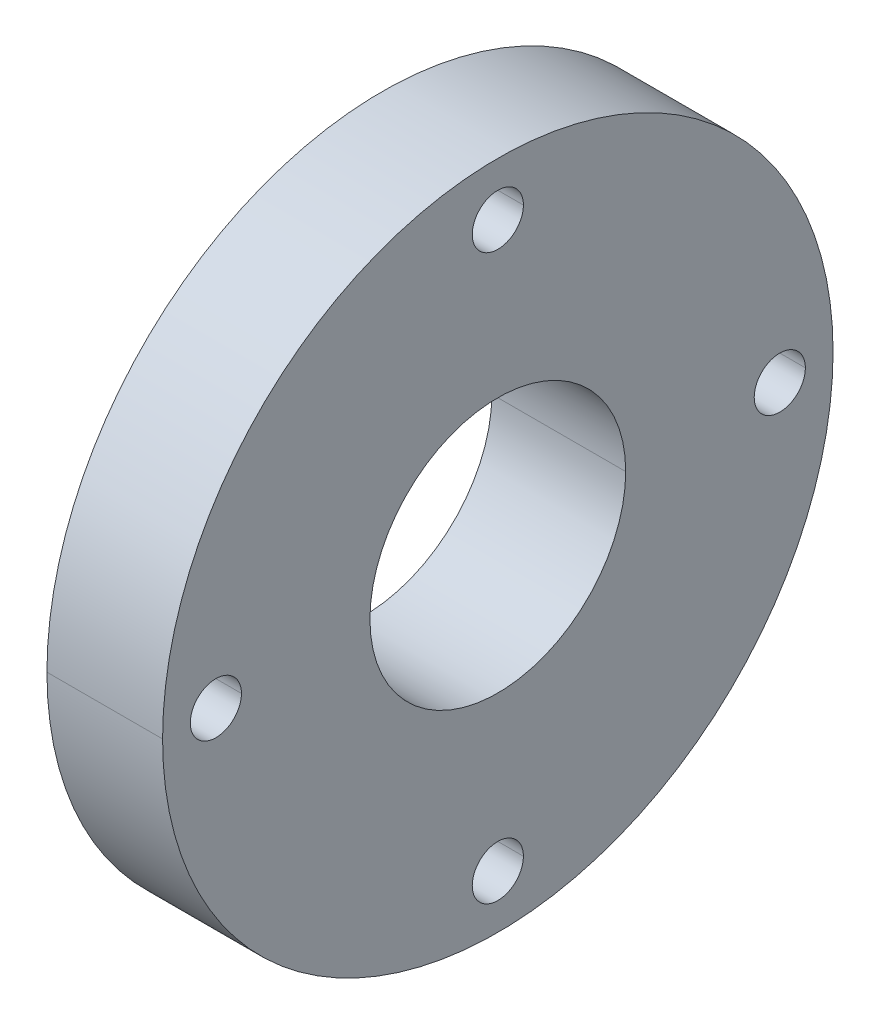
ISO-10303-21;
HEADER;
FILE_DESCRIPTION(('STEP AP214'),'2;1');
FILE_NAME('part.step','',(''),(''),'','','');
FILE_SCHEMA(('AUTOMOTIVE_DESIGN { 1 0 10303 214 1 1 1 1 }'));
ENDSEC;
DATA;
#1=APPLICATION_CONTEXT('core data for automotive mechanical design processes');
#2=APPLICATION_PROTOCOL_DEFINITION('international standard','automotive_design',2000,#1);
#3=PRODUCT_CONTEXT('',#1,'mechanical');
#4=PRODUCT('Part','Part','',(#3));
#5=PRODUCT_RELATED_PRODUCT_CATEGORY('part','',(#4));
#6=PRODUCT_DEFINITION_FORMATION('','',#4);
#7=PRODUCT_DEFINITION_CONTEXT('part definition',#1,'design');
#8=PRODUCT_DEFINITION('design','',#6,#7);
#9=PRODUCT_DEFINITION_SHAPE('','',#8);
#10=(LENGTH_UNIT() NAMED_UNIT(*) SI_UNIT(.MILLI.,.METRE.));
#11=(NAMED_UNIT(*) PLANE_ANGLE_UNIT() SI_UNIT($,.RADIAN.));
#12=(NAMED_UNIT(*) SI_UNIT($,.STERADIAN.) SOLID_ANGLE_UNIT());
#13=UNCERTAINTY_MEASURE_WITH_UNIT(LENGTH_MEASURE(1.E-05),#10,'distance_accuracy_value','');
#14=(GEOMETRIC_REPRESENTATION_CONTEXT(3) GLOBAL_UNCERTAINTY_ASSIGNED_CONTEXT((#13)) GLOBAL_UNIT_ASSIGNED_CONTEXT((#10,
#11,#12)) REPRESENTATION_CONTEXT('',''));
#15=CARTESIAN_POINT('',(0.,0.,0.));
#16=DIRECTION('',(0.,0.,1.));
#17=DIRECTION('',(1.,0.,0.));
#18=AXIS2_PLACEMENT_3D('',#15,#16,#17);
#19=CARTESIAN_POINT('',(-11.303,27.559,0.));
#20=DIRECTION('',(-1.,0.,0.));
#21=DIRECTION('',(0.,0.,1.));
#22=AXIS2_PLACEMENT_3D('',#19,#20,#21);
#23=CYLINDRICAL_SURFACE('',#22,2.5);
#24=DIRECTION('',(-1.,0.,0.));
#25=VECTOR('',#24,1.);
#26=CARTESIAN_POINT('',(-11.303,27.559,-2.5));
#27=LINE('',#26,#25);
#28=CARTESIAN_POINT('',(0.,27.559,-2.5));
#29=VERTEX_POINT('',#28);
#30=CARTESIAN_POINT('',(-11.303,27.559,-2.5));
#31=VERTEX_POINT('',#30);
#32=EDGE_CURVE('E253',#29,#31,#27,.T.);
#33=ORIENTED_EDGE('',*,*,#32,.F.);
#34=CARTESIAN_POINT('',(0.,27.559,0.));
#35=DIRECTION('',(1.,0.,0.));
#36=DIRECTION('',(0.,0.,-1.));
#37=AXIS2_PLACEMENT_3D('',#34,#35,#36);
#38=CIRCLE('',#37,2.5);
#39=CARTESIAN_POINT('',(0.,27.559,2.5));
#40=VERTEX_POINT('',#39);
#41=EDGE_CURVE('E204',#29,#40,#38,.T.);
#42=ORIENTED_EDGE('',*,*,#41,.T.);
#43=DIRECTION('',(-1.,0.,0.));
#44=VECTOR('',#43,1.);
#45=CARTESIAN_POINT('',(-11.303,27.559,2.5));
#46=LINE('',#45,#44);
#47=CARTESIAN_POINT('',(-11.303,27.559,2.5));
#48=VERTEX_POINT('',#47);
#49=EDGE_CURVE('E214',#40,#48,#46,.T.);
#50=ORIENTED_EDGE('',*,*,#49,.T.);
#51=CARTESIAN_POINT('',(-11.303,27.559,0.));
#52=DIRECTION('',(-1.,0.,0.));
#53=DIRECTION('',(0.,0.,1.));
#54=AXIS2_PLACEMENT_3D('',#51,#52,#53);
#55=CIRCLE('',#54,2.5);
#56=EDGE_CURVE('E189',#48,#31,#55,.T.);
#57=ORIENTED_EDGE('',*,*,#56,.T.);
#58=EDGE_LOOP('',(#33,#42,#50,#57));
#59=FACE_BOUND('',#58,.T.);
#60=ADVANCED_FACE('F18',(#59),#23,.F.);
#61=CARTESIAN_POINT('',(-11.303,0.,27.559));
#62=DIRECTION('',(-1.,0.,0.));
#63=DIRECTION('',(0.,0.,1.));
#64=AXIS2_PLACEMENT_3D('',#61,#62,#63);
#65=CYLINDRICAL_SURFACE('',#64,2.5);
#66=DIRECTION('',(-1.,0.,0.));
#67=VECTOR('',#66,1.);
#68=CARTESIAN_POINT('',(-11.303,0.,25.059));
#69=LINE('',#68,#67);
#70=CARTESIAN_POINT('',(0.,0.,25.059));
#71=VERTEX_POINT('',#70);
#72=CARTESIAN_POINT('',(-11.303,0.,25.059));
#73=VERTEX_POINT('',#72);
#74=EDGE_CURVE('E174',#71,#73,#69,.T.);
#75=ORIENTED_EDGE('',*,*,#74,.F.);
#76=CARTESIAN_POINT('',(0.,0.,27.559));
#77=DIRECTION('',(1.,0.,0.));
#78=DIRECTION('',(0.,0.,-1.));
#79=AXIS2_PLACEMENT_3D('',#76,#77,#78);
#80=CIRCLE('',#79,2.5);
#81=CARTESIAN_POINT('',(0.,0.,30.059));
#82=VERTEX_POINT('',#81);
#83=EDGE_CURVE('E147',#71,#82,#80,.T.);
#84=ORIENTED_EDGE('',*,*,#83,.T.);
#85=DIRECTION('',(-1.,0.,0.));
#86=VECTOR('',#85,1.);
#87=CARTESIAN_POINT('',(-11.303,0.,30.059));
#88=LINE('',#87,#86);
#89=CARTESIAN_POINT('',(-11.303,0.,30.059));
#90=VERTEX_POINT('',#89);
#91=EDGE_CURVE('E159',#82,#90,#88,.T.);
#92=ORIENTED_EDGE('',*,*,#91,.T.);
#93=CARTESIAN_POINT('',(-11.303,0.,27.559));
#94=DIRECTION('',(-1.,0.,0.));
#95=DIRECTION('',(0.,0.,1.));
#96=AXIS2_PLACEMENT_3D('',#93,#94,#95);
#97=CIRCLE('',#96,2.5);
#98=EDGE_CURVE('E126',#90,#73,#97,.T.);
#99=ORIENTED_EDGE('',*,*,#98,.T.);
#100=EDGE_LOOP('',(#75,#84,#92,#99));
#101=FACE_BOUND('',#100,.T.);
#102=ADVANCED_FACE('F368',(#101),#65,.F.);
#103=CARTESIAN_POINT('',(-11.303,-27.559,0.));
#104=DIRECTION('',(-1.,0.,0.));
#105=DIRECTION('',(0.,0.,1.));
#106=AXIS2_PLACEMENT_3D('',#103,#104,#105);
#107=CYLINDRICAL_SURFACE('',#106,2.5);
#108=DIRECTION('',(-1.,0.,0.));
#109=VECTOR('',#108,1.);
#110=CARTESIAN_POINT('',(-11.303,-27.559,-2.5));
#111=LINE('',#110,#109);
#112=CARTESIAN_POINT('',(0.,-27.559,-2.5));
#113=VERTEX_POINT('',#112);
#114=CARTESIAN_POINT('',(-11.303,-27.559,-2.5));
#115=VERTEX_POINT('',#114);
#116=EDGE_CURVE('E141',#113,#115,#111,.T.);
#117=ORIENTED_EDGE('',*,*,#116,.F.);
#118=CARTESIAN_POINT('',(0.,-27.559,0.));
#119=DIRECTION('',(1.,0.,0.));
#120=DIRECTION('',(0.,0.,-1.));
#121=AXIS2_PLACEMENT_3D('',#118,#119,#120);
#122=CIRCLE('',#121,2.5);
#123=CARTESIAN_POINT('',(0.,-27.559,2.5));
#124=VERTEX_POINT('',#123);
#125=EDGE_CURVE('E135',#113,#124,#122,.T.);
#126=ORIENTED_EDGE('',*,*,#125,.T.);
#127=DIRECTION('',(-1.,0.,0.));
#128=VECTOR('',#127,1.);
#129=CARTESIAN_POINT('',(-11.303,-27.559,2.5));
#130=LINE('',#129,#128);
#131=CARTESIAN_POINT('',(-11.303,-27.559,2.5));
#132=VERTEX_POINT('',#131);
#133=EDGE_CURVE('E138',#124,#132,#130,.T.);
#134=ORIENTED_EDGE('',*,*,#133,.T.);
#135=CARTESIAN_POINT('',(-11.303,-27.559,0.));
#136=DIRECTION('',(-1.,0.,0.));
#137=DIRECTION('',(0.,0.,1.));
#138=AXIS2_PLACEMENT_3D('',#135,#136,#137);
#139=CIRCLE('',#138,2.5);
#140=EDGE_CURVE('E188',#132,#115,#139,.T.);
#141=ORIENTED_EDGE('',*,*,#140,.T.);
#142=EDGE_LOOP('',(#117,#126,#134,#141));
#143=FACE_BOUND('',#142,.T.);
#144=ADVANCED_FACE('F137',(#143),#107,.F.);
#145=CARTESIAN_POINT('',(-11.303,0.,-27.559));
#146=DIRECTION('',(-1.,0.,0.));
#147=DIRECTION('',(0.,0.,1.));
#148=AXIS2_PLACEMENT_3D('',#145,#146,#147);
#149=CYLINDRICAL_SURFACE('',#148,2.5);
#150=DIRECTION('',(-1.,0.,0.));
#151=VECTOR('',#150,1.);
#152=CARTESIAN_POINT('',(-11.303,0.,-30.059));
#153=LINE('',#152,#151);
#154=CARTESIAN_POINT('',(0.,0.,-30.059));
#155=VERTEX_POINT('',#154);
#156=CARTESIAN_POINT('',(-11.303,0.,-30.059));
#157=VERTEX_POINT('',#156);
#158=EDGE_CURVE('E178',#155,#157,#153,.T.);
#159=ORIENTED_EDGE('',*,*,#158,.F.);
#160=CARTESIAN_POINT('',(0.,0.,-27.559));
#161=DIRECTION('',(1.,0.,0.));
#162=DIRECTION('',(0.,0.,-1.));
#163=AXIS2_PLACEMENT_3D('',#160,#161,#162);
#164=CIRCLE('',#163,2.5);
#165=CARTESIAN_POINT('',(0.,0.,-25.059));
#166=VERTEX_POINT('',#165);
#167=EDGE_CURVE('E146',#155,#166,#164,.T.);
#168=ORIENTED_EDGE('',*,*,#167,.T.);
#169=DIRECTION('',(-1.,0.,0.));
#170=VECTOR('',#169,1.);
#171=CARTESIAN_POINT('',(-11.303,0.,-25.059));
#172=LINE('',#171,#170);
#173=CARTESIAN_POINT('',(-11.303,0.,-25.059));
#174=VERTEX_POINT('',#173);
#175=EDGE_CURVE('E209',#166,#174,#172,.T.);
#176=ORIENTED_EDGE('',*,*,#175,.T.);
#177=CARTESIAN_POINT('',(-11.303,0.,-27.559));
#178=DIRECTION('',(-1.,0.,0.));
#179=DIRECTION('',(0.,0.,1.));
#180=AXIS2_PLACEMENT_3D('',#177,#178,#179);
#181=CIRCLE('',#180,2.5);
#182=EDGE_CURVE('E192',#174,#157,#181,.T.);
#183=ORIENTED_EDGE('',*,*,#182,.T.);
#184=EDGE_LOOP('',(#159,#168,#176,#183));
#185=FACE_BOUND('',#184,.T.);
#186=ADVANCED_FACE('F287',(#185),#149,.F.);
#187=CARTESIAN_POINT('',(0.,0.,0.));
#188=DIRECTION('',(-1.,0.,0.));
#189=DIRECTION('',(0.,0.,1.));
#190=AXIS2_PLACEMENT_3D('',#187,#188,#189);
#191=CYLINDRICAL_SURFACE('',#190,12.5);
#192=DIRECTION('',(-1.,0.,0.));
#193=VECTOR('',#192,1.);
#194=CARTESIAN_POINT('',(0.,0.,-12.5));
#195=LINE('',#194,#193);
#196=CARTESIAN_POINT('',(0.,0.,-12.5));
#197=VERTEX_POINT('',#196);
#198=CARTESIAN_POINT('',(-13.081,0.,-12.5));
#199=VERTEX_POINT('',#198);
#200=EDGE_CURVE('E231',#197,#199,#195,.T.);
#201=ORIENTED_EDGE('',*,*,#200,.F.);
#202=CARTESIAN_POINT('',(0.,0.,0.));
#203=DIRECTION('',(-1.,0.,0.));
#204=DIRECTION('',(0.,0.,1.));
#205=AXIS2_PLACEMENT_3D('',#202,#203,#204);
#206=CIRCLE('',#205,12.5);
#207=CARTESIAN_POINT('',(0.,0.,12.5));
#208=VERTEX_POINT('',#207);
#209=EDGE_CURVE('E240',#208,#197,#206,.T.);
#210=ORIENTED_EDGE('',*,*,#209,.F.);
#211=DIRECTION('',(-1.,0.,0.));
#212=VECTOR('',#211,1.);
#213=CARTESIAN_POINT('',(0.,0.,12.5));
#214=LINE('',#213,#212);
#215=CARTESIAN_POINT('',(-13.081,0.,12.5));
#216=VERTEX_POINT('',#215);
#217=EDGE_CURVE('E199',#208,#216,#214,.T.);
#218=ORIENTED_EDGE('',*,*,#217,.T.);
#219=CARTESIAN_POINT('',(-13.081,0.,0.));
#220=DIRECTION('',(-1.,0.,0.));
#221=DIRECTION('',(0.,0.,1.));
#222=AXIS2_PLACEMENT_3D('',#219,#220,#221);
#223=CIRCLE('',#222,12.5);
#224=EDGE_CURVE('E11',#216,#199,#223,.T.);
#225=ORIENTED_EDGE('',*,*,#224,.T.);
#226=EDGE_LOOP('',(#201,#210,#218,#225));
#227=FACE_BOUND('',#226,.T.);
#228=ADVANCED_FACE('F380',(#227),#191,.F.);
#229=CARTESIAN_POINT('',(-13.081,0.,0.));
#230=DIRECTION('',(-1.,0.,0.));
#231=DIRECTION('',(0.,0.,1.));
#232=AXIS2_PLACEMENT_3D('',#229,#230,#231);
#233=PLANE('',#232);
#234=ORIENTED_EDGE('',*,*,#224,.F.);
#235=CARTESIAN_POINT('',(-13.081,0.,0.));
#236=DIRECTION('',(-1.,0.,0.));
#237=DIRECTION('',(0.,0.,1.));
#238=AXIS2_PLACEMENT_3D('',#235,#236,#237);
#239=CIRCLE('',#238,12.5);
#240=EDGE_CURVE('E232',#199,#216,#239,.T.);
#241=ORIENTED_EDGE('',*,*,#240,.F.);
#242=EDGE_LOOP('',(#234,#241));
#243=FACE_BOUND('',#242,.T.);
#244=CARTESIAN_POINT('',(-13.081,0.,0.));
#245=DIRECTION('',(-1.,0.,0.));
#246=DIRECTION('',(0.,0.,1.));
#247=AXIS2_PLACEMENT_3D('',#244,#245,#246);
#248=CIRCLE('',#247,22.479);
#249=CARTESIAN_POINT('',(-13.081,0.,-22.479));
#250=VERTEX_POINT('',#249);
#251=CARTESIAN_POINT('',(-13.081,0.,22.479));
#252=VERTEX_POINT('',#251);
#253=EDGE_CURVE('E29',#250,#252,#248,.T.);
#254=ORIENTED_EDGE('',*,*,#253,.T.);
#255=CARTESIAN_POINT('',(-13.081,0.,0.));
#256=DIRECTION('',(-1.,0.,0.));
#257=DIRECTION('',(0.,0.,1.));
#258=AXIS2_PLACEMENT_3D('',#255,#256,#257);
#259=CIRCLE('',#258,22.479);
#260=EDGE_CURVE('E194',#252,#250,#259,.T.);
#261=ORIENTED_EDGE('',*,*,#260,.T.);
#262=EDGE_LOOP('',(#254,#261));
#263=FACE_BOUND('',#262,.T.);
#264=ADVANCED_FACE('F376',(#243,#263),#233,.T.);
#265=CARTESIAN_POINT('',(-13.081,0.,0.));
#266=DIRECTION('',(1.,0.,0.));
#267=DIRECTION('',(0.,0.,-1.));
#268=AXIS2_PLACEMENT_3D('',#265,#266,#267);
#269=CYLINDRICAL_SURFACE('',#268,22.479);
#270=DIRECTION('',(1.,0.,0.));
#271=VECTOR('',#270,1.);
#272=CARTESIAN_POINT('',(-13.081,0.,22.479));
#273=LINE('',#272,#271);
#274=CARTESIAN_POINT('',(-11.303,0.,22.479));
#275=VERTEX_POINT('',#274);
#276=EDGE_CURVE('E198',#252,#275,#273,.T.);
#277=ORIENTED_EDGE('',*,*,#276,.F.);
#278=ORIENTED_EDGE('',*,*,#253,.F.);
#279=DIRECTION('',(1.,0.,0.));
#280=VECTOR('',#279,1.);
#281=CARTESIAN_POINT('',(-13.081,0.,-22.479));
#282=LINE('',#281,#280);
#283=CARTESIAN_POINT('',(-11.303,0.,-22.479));
#284=VERTEX_POINT('',#283);
#285=EDGE_CURVE('E215',#250,#284,#282,.T.);
#286=ORIENTED_EDGE('',*,*,#285,.T.);
#287=CARTESIAN_POINT('',(-11.303,0.,0.));
#288=DIRECTION('',(-1.,0.,0.));
#289=DIRECTION('',(0.,0.,-1.));
#290=AXIS2_PLACEMENT_3D('',#287,#288,#289);
#291=CIRCLE('',#290,22.479);
#292=EDGE_CURVE('E190',#284,#275,#291,.T.);
#293=ORIENTED_EDGE('',*,*,#292,.T.);
#294=EDGE_LOOP('',(#277,#278,#286,#293));
#295=FACE_BOUND('',#294,.T.);
#296=ADVANCED_FACE('F373',(#295),#269,.T.);
#297=CARTESIAN_POINT('',(0.,0.,0.));
#298=DIRECTION('',(1.,0.,0.));
#299=DIRECTION('',(0.,1.,0.));
#300=AXIS2_PLACEMENT_3D('',#297,#298,#299);
#301=PLANE('',#300);
#302=ORIENTED_EDGE('',*,*,#209,.T.);
#303=CARTESIAN_POINT('',(0.,0.,0.));
#304=DIRECTION('',(-1.,0.,0.));
#305=DIRECTION('',(0.,0.,1.));
#306=AXIS2_PLACEMENT_3D('',#303,#304,#305);
#307=CIRCLE('',#306,12.5);
#308=EDGE_CURVE('E227',#197,#208,#307,.T.);
#309=ORIENTED_EDGE('',*,*,#308,.T.);
#310=EDGE_LOOP('',(#302,#309));
#311=FACE_BOUND('',#310,.T.);
#312=CARTESIAN_POINT('',(0.,0.,-27.559));
#313=DIRECTION('',(1.,0.,0.));
#314=DIRECTION('',(0.,0.,-1.));
#315=AXIS2_PLACEMENT_3D('',#312,#313,#314);
#316=CIRCLE('',#315,2.5);
#317=EDGE_CURVE('E154',#166,#155,#316,.T.);
#318=ORIENTED_EDGE('',*,*,#317,.F.);
#319=ORIENTED_EDGE('',*,*,#167,.F.);
#320=EDGE_LOOP('',(#318,#319));
#321=FACE_BOUND('',#320,.T.);
#322=CARTESIAN_POINT('',(0.,-27.559,0.));
#323=DIRECTION('',(1.,0.,0.));
#324=DIRECTION('',(0.,0.,-1.));
#325=AXIS2_PLACEMENT_3D('',#322,#323,#324);
#326=CIRCLE('',#325,2.5);
#327=EDGE_CURVE('E22',#124,#113,#326,.T.);
#328=ORIENTED_EDGE('',*,*,#327,.F.);
#329=ORIENTED_EDGE('',*,*,#125,.F.);
#330=EDGE_LOOP('',(#328,#329));
#331=FACE_BOUND('',#330,.T.);
#332=CARTESIAN_POINT('',(0.,0.,27.559));
#333=DIRECTION('',(1.,0.,0.));
#334=DIRECTION('',(0.,0.,-1.));
#335=AXIS2_PLACEMENT_3D('',#332,#333,#334);
#336=CIRCLE('',#335,2.5);
#337=EDGE_CURVE('E210',#82,#71,#336,.T.);
#338=ORIENTED_EDGE('',*,*,#337,.F.);
#339=ORIENTED_EDGE('',*,*,#83,.F.);
#340=EDGE_LOOP('',(#338,#339));
#341=FACE_BOUND('',#340,.T.);
#342=CARTESIAN_POINT('',(0.,27.559,0.));
#343=DIRECTION('',(1.,0.,0.));
#344=DIRECTION('',(0.,0.,-1.));
#345=AXIS2_PLACEMENT_3D('',#342,#343,#344);
#346=CIRCLE('',#345,2.5);
#347=EDGE_CURVE('E266',#40,#29,#346,.T.);
#348=ORIENTED_EDGE('',*,*,#347,.F.);
#349=ORIENTED_EDGE('',*,*,#41,.F.);
#350=EDGE_LOOP('',(#348,#349));
#351=FACE_BOUND('',#350,.T.);
#352=CARTESIAN_POINT('',(0.,0.,0.));
#353=DIRECTION('',(1.,0.,0.));
#354=DIRECTION('',(0.,0.,-1.));
#355=AXIS2_PLACEMENT_3D('',#352,#353,#354);
#356=CIRCLE('',#355,32.766);
#357=CARTESIAN_POINT('',(0.,0.,-32.766));
#358=VERTEX_POINT('',#357);
#359=CARTESIAN_POINT('',(0.,0.,32.766));
#360=VERTEX_POINT('',#359);
#361=EDGE_CURVE('E184',#358,#360,#356,.T.);
#362=ORIENTED_EDGE('',*,*,#361,.T.);
#363=CARTESIAN_POINT('',(0.,0.,0.));
#364=DIRECTION('',(1.,0.,0.));
#365=DIRECTION('',(0.,0.,-1.));
#366=AXIS2_PLACEMENT_3D('',#363,#364,#365);
#367=CIRCLE('',#366,32.766);
#368=EDGE_CURVE('E43',#360,#358,#367,.T.);
#369=ORIENTED_EDGE('',*,*,#368,.T.);
#370=EDGE_LOOP('',(#362,#369));
#371=FACE_BOUND('',#370,.T.);
#372=ADVANCED_FACE('F156',(#311,#321,#331,#341,#351,#371),#301,.T.);
#373=CARTESIAN_POINT('',(-11.303,0.,0.));
#374=DIRECTION('',(1.,0.,0.));
#375=DIRECTION('',(0.,0.,-1.));
#376=AXIS2_PLACEMENT_3D('',#373,#374,#375);
#377=CYLINDRICAL_SURFACE('',#376,32.766);
#378=DIRECTION('',(1.,0.,0.));
#379=VECTOR('',#378,1.);
#380=CARTESIAN_POINT('',(-11.303,0.,32.766));
#381=LINE('',#380,#379);
#382=CARTESIAN_POINT('',(-11.303,0.,32.766));
#383=VERTEX_POINT('',#382);
#384=EDGE_CURVE('E180',#383,#360,#381,.T.);
#385=ORIENTED_EDGE('',*,*,#384,.F.);
#386=CARTESIAN_POINT('',(-11.303,0.,0.));
#387=DIRECTION('',(1.,0.,0.));
#388=DIRECTION('',(0.,0.,-1.));
#389=AXIS2_PLACEMENT_3D('',#386,#387,#388);
#390=CIRCLE('',#389,32.766);
#391=CARTESIAN_POINT('',(-11.303,0.,-32.766));
#392=VERTEX_POINT('',#391);
#393=EDGE_CURVE('E220',#383,#392,#390,.T.);
#394=ORIENTED_EDGE('',*,*,#393,.T.);
#395=DIRECTION('',(1.,0.,0.));
#396=VECTOR('',#395,1.);
#397=CARTESIAN_POINT('',(-11.303,0.,-32.766));
#398=LINE('',#397,#396);
#399=EDGE_CURVE('E224',#392,#358,#398,.T.);
#400=ORIENTED_EDGE('',*,*,#399,.T.);
#401=ORIENTED_EDGE('',*,*,#368,.F.);
#402=EDGE_LOOP('',(#385,#394,#400,#401));
#403=FACE_BOUND('',#402,.T.);
#404=ADVANCED_FACE('F354',(#403),#377,.T.);
#405=CARTESIAN_POINT('',(-11.303,0.,0.));
#406=DIRECTION('',(1.,0.,0.));
#407=DIRECTION('',(0.,1.,0.));
#408=AXIS2_PLACEMENT_3D('',#405,#406,#407);
#409=PLANE('',#408);
#410=ORIENTED_EDGE('',*,*,#292,.F.);
#411=CARTESIAN_POINT('',(-11.303,0.,0.));
#412=DIRECTION('',(-1.,0.,0.));
#413=DIRECTION('',(0.,0.,-1.));
#414=AXIS2_PLACEMENT_3D('',#411,#412,#413);
#415=CIRCLE('',#414,22.479);
#416=EDGE_CURVE('E219',#275,#284,#415,.T.);
#417=ORIENTED_EDGE('',*,*,#416,.F.);
#418=EDGE_LOOP('',(#410,#417));
#419=FACE_BOUND('',#418,.T.);
#420=ORIENTED_EDGE('',*,*,#182,.F.);
#421=CARTESIAN_POINT('',(-11.303,0.,-27.559));
#422=DIRECTION('',(-1.,0.,0.));
#423=DIRECTION('',(0.,0.,1.));
#424=AXIS2_PLACEMENT_3D('',#421,#422,#423);
#425=CIRCLE('',#424,2.5);
#426=EDGE_CURVE('E205',#157,#174,#425,.T.);
#427=ORIENTED_EDGE('',*,*,#426,.F.);
#428=EDGE_LOOP('',(#420,#427));
#429=FACE_BOUND('',#428,.T.);
#430=ORIENTED_EDGE('',*,*,#140,.F.);
#431=CARTESIAN_POINT('',(-11.303,-27.559,0.));
#432=DIRECTION('',(-1.,0.,0.));
#433=DIRECTION('',(0.,0.,1.));
#434=AXIS2_PLACEMENT_3D('',#431,#432,#433);
#435=CIRCLE('',#434,2.5);
#436=EDGE_CURVE('E152',#115,#132,#435,.T.);
#437=ORIENTED_EDGE('',*,*,#436,.F.);
#438=EDGE_LOOP('',(#430,#437));
#439=FACE_BOUND('',#438,.T.);
#440=ORIENTED_EDGE('',*,*,#98,.F.);
#441=CARTESIAN_POINT('',(-11.303,0.,27.559));
#442=DIRECTION('',(-1.,0.,0.));
#443=DIRECTION('',(0.,0.,1.));
#444=AXIS2_PLACEMENT_3D('',#441,#442,#443);
#445=CIRCLE('',#444,2.5);
#446=EDGE_CURVE('E166',#73,#90,#445,.T.);
#447=ORIENTED_EDGE('',*,*,#446,.F.);
#448=EDGE_LOOP('',(#440,#447));
#449=FACE_BOUND('',#448,.T.);
#450=ORIENTED_EDGE('',*,*,#56,.F.);
#451=CARTESIAN_POINT('',(-11.303,27.559,0.));
#452=DIRECTION('',(-1.,0.,0.));
#453=DIRECTION('',(0.,0.,1.));
#454=AXIS2_PLACEMENT_3D('',#451,#452,#453);
#455=CIRCLE('',#454,2.5);
#456=EDGE_CURVE('E249',#31,#48,#455,.T.);
#457=ORIENTED_EDGE('',*,*,#456,.F.);
#458=EDGE_LOOP('',(#450,#457));
#459=FACE_BOUND('',#458,.T.);
#460=CARTESIAN_POINT('',(-11.303,0.,0.));
#461=DIRECTION('',(1.,0.,0.));
#462=DIRECTION('',(0.,0.,-1.));
#463=AXIS2_PLACEMENT_3D('',#460,#461,#462);
#464=CIRCLE('',#463,32.766);
#465=EDGE_CURVE('E185',#392,#383,#464,.T.);
#466=ORIENTED_EDGE('',*,*,#465,.F.);
#467=ORIENTED_EDGE('',*,*,#393,.F.);
#468=EDGE_LOOP('',(#466,#467));
#469=FACE_BOUND('',#468,.T.);
#470=ADVANCED_FACE('F292',(#419,#429,#439,#449,#459,#469),#409,.F.);
#471=CARTESIAN_POINT('',(-11.303,0.,0.));
#472=DIRECTION('',(1.,0.,0.));
#473=DIRECTION('',(0.,0.,-1.));
#474=AXIS2_PLACEMENT_3D('',#471,#472,#473);
#475=CYLINDRICAL_SURFACE('',#474,32.766);
#476=ORIENTED_EDGE('',*,*,#465,.T.);
#477=ORIENTED_EDGE('',*,*,#384,.T.);
#478=ORIENTED_EDGE('',*,*,#361,.F.);
#479=ORIENTED_EDGE('',*,*,#399,.F.);
#480=EDGE_LOOP('',(#476,#477,#478,#479));
#481=FACE_BOUND('',#480,.T.);
#482=ADVANCED_FACE('F317',(#481),#475,.T.);
#483=CARTESIAN_POINT('',(-13.081,0.,0.));
#484=DIRECTION('',(1.,0.,0.));
#485=DIRECTION('',(0.,0.,-1.));
#486=AXIS2_PLACEMENT_3D('',#483,#484,#485);
#487=CYLINDRICAL_SURFACE('',#486,22.479);
#488=ORIENTED_EDGE('',*,*,#260,.F.);
#489=ORIENTED_EDGE('',*,*,#276,.T.);
#490=ORIENTED_EDGE('',*,*,#416,.T.);
#491=ORIENTED_EDGE('',*,*,#285,.F.);
#492=EDGE_LOOP('',(#488,#489,#490,#491));
#493=FACE_BOUND('',#492,.T.);
#494=ADVANCED_FACE('F362',(#493),#487,.T.);
#495=CARTESIAN_POINT('',(0.,0.,0.));
#496=DIRECTION('',(-1.,0.,0.));
#497=DIRECTION('',(0.,0.,1.));
#498=AXIS2_PLACEMENT_3D('',#495,#496,#497);
#499=CYLINDRICAL_SURFACE('',#498,12.5);
#500=ORIENTED_EDGE('',*,*,#308,.F.);
#501=ORIENTED_EDGE('',*,*,#200,.T.);
#502=ORIENTED_EDGE('',*,*,#240,.T.);
#503=ORIENTED_EDGE('',*,*,#217,.F.);
#504=EDGE_LOOP('',(#500,#501,#502,#503));
#505=FACE_BOUND('',#504,.T.);
#506=ADVANCED_FACE('F395',(#505),#499,.F.);
#507=CARTESIAN_POINT('',(-11.303,0.,-27.559));
#508=DIRECTION('',(-1.,0.,0.));
#509=DIRECTION('',(0.,0.,1.));
#510=AXIS2_PLACEMENT_3D('',#507,#508,#509);
#511=CYLINDRICAL_SURFACE('',#510,2.5);
#512=ORIENTED_EDGE('',*,*,#317,.T.);
#513=ORIENTED_EDGE('',*,*,#158,.T.);
#514=ORIENTED_EDGE('',*,*,#426,.T.);
#515=ORIENTED_EDGE('',*,*,#175,.F.);
#516=EDGE_LOOP('',(#512,#513,#514,#515));
#517=FACE_BOUND('',#516,.T.);
#518=ADVANCED_FACE('F295',(#517),#511,.F.);
#519=CARTESIAN_POINT('',(-11.303,-27.559,0.));
#520=DIRECTION('',(-1.,0.,0.));
#521=DIRECTION('',(0.,0.,1.));
#522=AXIS2_PLACEMENT_3D('',#519,#520,#521);
#523=CYLINDRICAL_SURFACE('',#522,2.5);
#524=ORIENTED_EDGE('',*,*,#327,.T.);
#525=ORIENTED_EDGE('',*,*,#116,.T.);
#526=ORIENTED_EDGE('',*,*,#436,.T.);
#527=ORIENTED_EDGE('',*,*,#133,.F.);
#528=EDGE_LOOP('',(#524,#525,#526,#527));
#529=FACE_BOUND('',#528,.T.);
#530=ADVANCED_FACE('F150',(#529),#523,.F.);
#531=CARTESIAN_POINT('',(-11.303,0.,27.559));
#532=DIRECTION('',(-1.,0.,0.));
#533=DIRECTION('',(0.,0.,1.));
#534=AXIS2_PLACEMENT_3D('',#531,#532,#533);
#535=CYLINDRICAL_SURFACE('',#534,2.5);
#536=ORIENTED_EDGE('',*,*,#337,.T.);
#537=ORIENTED_EDGE('',*,*,#74,.T.);
#538=ORIENTED_EDGE('',*,*,#446,.T.);
#539=ORIENTED_EDGE('',*,*,#91,.F.);
#540=EDGE_LOOP('',(#536,#537,#538,#539));
#541=FACE_BOUND('',#540,.T.);
#542=ADVANCED_FACE('F20',(#541),#535,.F.);
#543=CARTESIAN_POINT('',(-11.303,27.559,0.));
#544=DIRECTION('',(-1.,0.,0.));
#545=DIRECTION('',(0.,0.,1.));
#546=AXIS2_PLACEMENT_3D('',#543,#544,#545);
#547=CYLINDRICAL_SURFACE('',#546,2.5);
#548=ORIENTED_EDGE('',*,*,#347,.T.);
#549=ORIENTED_EDGE('',*,*,#32,.T.);
#550=ORIENTED_EDGE('',*,*,#456,.T.);
#551=ORIENTED_EDGE('',*,*,#49,.F.);
#552=EDGE_LOOP('',(#548,#549,#550,#551));
#553=FACE_BOUND('',#552,.T.);
#554=ADVANCED_FACE('F351',(#553),#547,.F.);
#555=CLOSED_SHELL('',(#60,#102,#144,#186,#228,#264,#296,#372,#404,#470,#482,#494,#506,#518,#530,
#542,#554));
#556=MANIFOLD_SOLID_BREP('B1',#555);
#557=ADVANCED_BREP_SHAPE_REPRESENTATION('',(#18,#556),#14);
#558=SHAPE_DEFINITION_REPRESENTATION(#9,#557);
ENDSEC;
END-ISO-10303-21;
